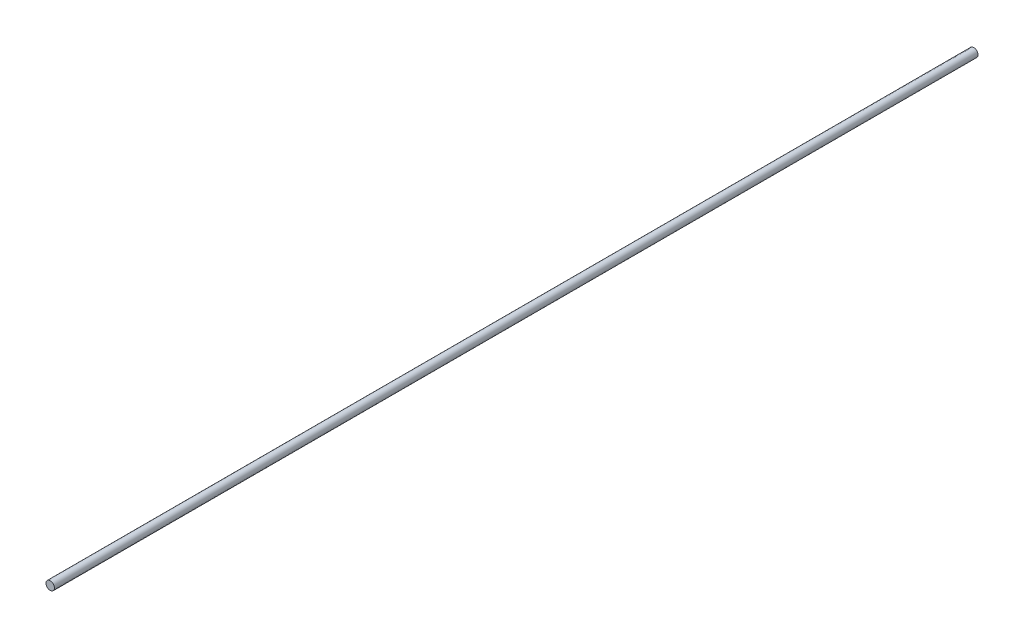
ISO-10303-21;
HEADER;
FILE_DESCRIPTION(('STEP AP214'),'2;1');
FILE_NAME('part.step','',(''),(''),'','','');
FILE_SCHEMA(('AUTOMOTIVE_DESIGN { 1 0 10303 214 1 1 1 1 }'));
ENDSEC;
DATA;
#1=APPLICATION_CONTEXT('core data for automotive mechanical design processes');
#2=APPLICATION_PROTOCOL_DEFINITION('international standard','automotive_design',2000,#1);
#3=PRODUCT_CONTEXT('',#1,'mechanical');
#4=PRODUCT('Part','Part','',(#3));
#5=PRODUCT_RELATED_PRODUCT_CATEGORY('part','',(#4));
#6=PRODUCT_DEFINITION_FORMATION('','',#4);
#7=PRODUCT_DEFINITION_CONTEXT('part definition',#1,'design');
#8=PRODUCT_DEFINITION('design','',#6,#7);
#9=PRODUCT_DEFINITION_SHAPE('','',#8);
#10=(LENGTH_UNIT() NAMED_UNIT(*) SI_UNIT(.MILLI.,.METRE.));
#11=(NAMED_UNIT(*) PLANE_ANGLE_UNIT() SI_UNIT($,.RADIAN.));
#12=(NAMED_UNIT(*) SI_UNIT($,.STERADIAN.) SOLID_ANGLE_UNIT());
#13=UNCERTAINTY_MEASURE_WITH_UNIT(LENGTH_MEASURE(1.E-05),#10,'distance_accuracy_value','');
#14=(GEOMETRIC_REPRESENTATION_CONTEXT(3) GLOBAL_UNCERTAINTY_ASSIGNED_CONTEXT((#13)) GLOBAL_UNIT_ASSIGNED_CONTEXT((#10,
#11,#12)) REPRESENTATION_CONTEXT('',''));
#15=CARTESIAN_POINT('',(0.,0.,0.));
#16=DIRECTION('',(0.,0.,1.));
#17=DIRECTION('',(1.,0.,0.));
#18=AXIS2_PLACEMENT_3D('',#15,#16,#17);
#19=CARTESIAN_POINT('',(0.,0.,875.));
#20=DIRECTION('',(0.,0.,-1.));
#21=DIRECTION('',(-1.,0.,0.));
#22=AXIS2_PLACEMENT_3D('',#19,#20,#21);
#23=CYLINDRICAL_SURFACE('',#22,4.);
#24=CARTESIAN_POINT('',(0.,0.,875.));
#25=DIRECTION('',(0.,0.,1.));
#26=DIRECTION('',(1.,0.,0.));
#27=AXIS2_PLACEMENT_3D('',#24,#25,#26);
#28=CIRCLE('',#27,4.);
#29=CARTESIAN_POINT('',(4.,0.,875.));
#30=VERTEX_POINT('',#29);
#31=EDGE_CURVE('E10',#30,#30,#28,.T.);
#32=ORIENTED_EDGE('',*,*,#31,.F.);
#33=EDGE_LOOP('',(#32));
#34=FACE_BOUND('',#33,.T.);
#35=CARTESIAN_POINT('',(0.,0.,0.));
#36=DIRECTION('',(0.,0.,1.));
#37=DIRECTION('',(1.,0.,0.));
#38=AXIS2_PLACEMENT_3D('',#35,#36,#37);
#39=CIRCLE('',#38,4.);
#40=CARTESIAN_POINT('',(4.,0.,0.));
#41=VERTEX_POINT('',#40);
#42=EDGE_CURVE('E34',#41,#41,#39,.T.);
#43=ORIENTED_EDGE('',*,*,#42,.T.);
#44=EDGE_LOOP('',(#43));
#45=FACE_BOUND('',#44,.T.);
#46=ADVANCED_FACE('F31',(#34,#45),#23,.T.);
#47=CARTESIAN_POINT('',(0.,0.,875.));
#48=DIRECTION('',(0.,0.,1.));
#49=DIRECTION('',(1.,0.,0.));
#50=AXIS2_PLACEMENT_3D('',#47,#48,#49);
#51=PLANE('',#50);
#52=ORIENTED_EDGE('',*,*,#31,.T.);
#53=EDGE_LOOP('',(#52));
#54=FACE_BOUND('',#53,.T.);
#55=ADVANCED_FACE('F46',(#54),#51,.T.);
#56=CARTESIAN_POINT('',(0.,0.,0.));
#57=DIRECTION('',(0.,0.,1.));
#58=DIRECTION('',(1.,0.,0.));
#59=AXIS2_PLACEMENT_3D('',#56,#57,#58);
#60=PLANE('',#59);
#61=ORIENTED_EDGE('',*,*,#42,.F.);
#62=EDGE_LOOP('',(#61));
#63=FACE_BOUND('',#62,.T.);
#64=ADVANCED_FACE('F44',(#63),#60,.F.);
#65=CLOSED_SHELL('',(#46,#55,#64));
#66=MANIFOLD_SOLID_BREP('B2',#65);
#67=ADVANCED_BREP_SHAPE_REPRESENTATION('',(#18,#66),#14);
#68=SHAPE_DEFINITION_REPRESENTATION(#9,#67);
ENDSEC;
END-ISO-10303-21;
